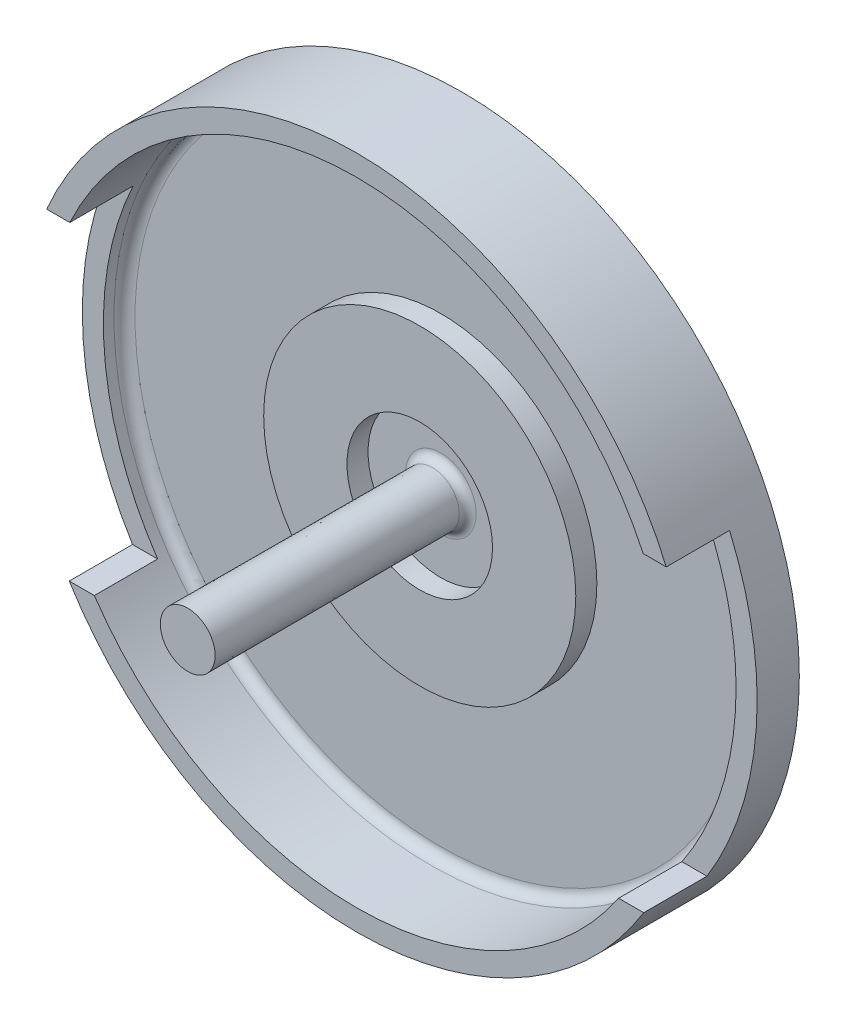
ISO-10303-21;
HEADER;
FILE_DESCRIPTION(('STEP AP214'),'2;1');
FILE_NAME('part.step','',(''),(''),'','','');
FILE_SCHEMA(('AUTOMOTIVE_DESIGN { 1 0 10303 214 1 1 1 1 }'));
ENDSEC;
DATA;
#1=APPLICATION_CONTEXT('core data for automotive mechanical design processes');
#2=APPLICATION_PROTOCOL_DEFINITION('international standard','automotive_design',2000,#1);
#3=PRODUCT_CONTEXT('',#1,'mechanical');
#4=PRODUCT('Part','Part','',(#3));
#5=PRODUCT_RELATED_PRODUCT_CATEGORY('part','',(#4));
#6=PRODUCT_DEFINITION_FORMATION('','',#4);
#7=PRODUCT_DEFINITION_CONTEXT('part definition',#1,'design');
#8=PRODUCT_DEFINITION('design','',#6,#7);
#9=PRODUCT_DEFINITION_SHAPE('','',#8);
#10=(LENGTH_UNIT() NAMED_UNIT(*) SI_UNIT(.MILLI.,.METRE.));
#11=(NAMED_UNIT(*) PLANE_ANGLE_UNIT() SI_UNIT($,.RADIAN.));
#12=(NAMED_UNIT(*) SI_UNIT($,.STERADIAN.) SOLID_ANGLE_UNIT());
#13=UNCERTAINTY_MEASURE_WITH_UNIT(LENGTH_MEASURE(1.E-05),#10,'distance_accuracy_value','');
#14=(GEOMETRIC_REPRESENTATION_CONTEXT(3) GLOBAL_UNCERTAINTY_ASSIGNED_CONTEXT((#13)) GLOBAL_UNIT_ASSIGNED_CONTEXT((#10,
#11,#12)) REPRESENTATION_CONTEXT('',''));
#15=CARTESIAN_POINT('',(0.,0.,0.));
#16=DIRECTION('',(0.,0.,1.));
#17=DIRECTION('',(1.,0.,0.));
#18=AXIS2_PLACEMENT_3D('',#15,#16,#17);
#19=CARTESIAN_POINT('',(0.,0.,1.));
#20=DIRECTION('',(0.,0.,1.));
#21=DIRECTION('',(1.,0.,0.));
#22=AXIS2_PLACEMENT_3D('',#19,#20,#21);
#23=PLANE('',#22);
#24=CARTESIAN_POINT('',(0.,0.,1.));
#25=DIRECTION('',(0.,0.,1.));
#26=DIRECTION('',(1.,0.,0.));
#27=AXIS2_PLACEMENT_3D('',#24,#25,#26);
#28=CIRCLE('',#27,1.67583420138795);
#29=CARTESIAN_POINT('',(1.67583420138795,0.,1.));
#30=VERTEX_POINT('',#29);
#31=EDGE_CURVE('E12',#30,#30,#28,.F.);
#32=ORIENTED_EDGE('',*,*,#31,.T.);
#33=EDGE_LOOP('',(#32));
#34=FACE_BOUND('',#33,.T.);
#35=CARTESIAN_POINT('',(0.,0.,1.));
#36=DIRECTION('',(0.,0.,1.));
#37=DIRECTION('',(1.,0.,0.));
#38=AXIS2_PLACEMENT_3D('',#35,#36,#37);
#39=CIRCLE('',#38,3.45);
#40=CARTESIAN_POINT('',(3.45,0.,1.));
#41=VERTEX_POINT('',#40);
#42=EDGE_CURVE('E392',#41,#41,#39,.T.);
#43=ORIENTED_EDGE('',*,*,#42,.T.);
#44=EDGE_LOOP('',(#43));
#45=FACE_BOUND('',#44,.T.);
#46=ADVANCED_FACE('F43',(#34,#45),#23,.T.);
#47=CARTESIAN_POINT('',(0.,0.,5.));
#48=DIRECTION('',(0.,0.,1.));
#49=DIRECTION('',(1.,0.,0.));
#50=AXIS2_PLACEMENT_3D('',#47,#48,#49);
#51=PLANE('',#50);
#52=CARTESIAN_POINT('',(0.,0.,5.));
#53=DIRECTION('',(0.,0.,1.));
#54=DIRECTION('',(1.,0.,0.));
#55=AXIS2_PLACEMENT_3D('',#52,#53,#54);
#56=CIRCLE('',#55,16.);
#57=CARTESIAN_POINT('',(-13.6201960323075,-8.39584778575195,5.));
#58=VERTEX_POINT('',#57);
#59=CARTESIAN_POINT('',(13.6201960323075,-8.39584778575195,5.));
#60=VERTEX_POINT('',#59);
#61=EDGE_CURVE('E156',#58,#60,#56,.T.);
#62=ORIENTED_EDGE('',*,*,#61,.T.);
#63=DIRECTION('',(-1.,0.,0.));
#64=VECTOR('',#63,1.);
#65=CARTESIAN_POINT('',(0.,-8.39584778575195,5.));
#66=LINE('',#65,#64);
#67=CARTESIAN_POINT('',(12.4301946870708,-8.39584778575195,5.));
#68=VERTEX_POINT('',#67);
#69=EDGE_CURVE('E112',#60,#68,#66,.T.);
#70=ORIENTED_EDGE('',*,*,#69,.T.);
#71=CARTESIAN_POINT('',(0.,0.,5.));
#72=DIRECTION('',(0.,0.,1.));
#73=DIRECTION('',(1.,0.,0.));
#74=AXIS2_PLACEMENT_3D('',#71,#72,#73);
#75=CIRCLE('',#74,15.);
#76=CARTESIAN_POINT('',(-12.4301946870708,-8.39584778575195,5.));
#77=VERTEX_POINT('',#76);
#78=EDGE_CURVE('E153',#77,#68,#75,.T.);
#79=ORIENTED_EDGE('',*,*,#78,.F.);
#80=DIRECTION('',(1.,0.,0.));
#81=VECTOR('',#80,1.);
#82=CARTESIAN_POINT('',(0.,-8.39584778575195,5.));
#83=LINE('',#82,#81);
#84=EDGE_CURVE('E145',#58,#77,#83,.T.);
#85=ORIENTED_EDGE('',*,*,#84,.F.);
#86=EDGE_LOOP('',(#62,#70,#79,#85));
#87=FACE_BOUND('',#86,.T.);
#88=ADVANCED_FACE('F197',(#87),#51,.T.);
#89=CARTESIAN_POINT('',(0.,0.,5.));
#90=DIRECTION('',(0.,0.,-1.));
#91=DIRECTION('',(-1.,0.,0.));
#92=AXIS2_PLACEMENT_3D('',#89,#90,#91);
#93=CYLINDRICAL_SURFACE('',#92,16.);
#94=CARTESIAN_POINT('',(0.,0.,0.));
#95=DIRECTION('',(0.,0.,1.));
#96=DIRECTION('',(1.,0.,0.));
#97=AXIS2_PLACEMENT_3D('',#94,#95,#96);
#98=CIRCLE('',#97,16.);
#99=CARTESIAN_POINT('',(16.,0.,0.));
#100=VERTEX_POINT('',#99);
#101=EDGE_CURVE('E159',#100,#100,#98,.T.);
#102=ORIENTED_EDGE('',*,*,#101,.T.);
#103=EDGE_LOOP('',(#102));
#104=FACE_BOUND('',#103,.T.);
#105=CARTESIAN_POINT('',(14.6905696553376,6.33933460243845,5.));
#106=VERTEX_POINT('',#105);
#107=CARTESIAN_POINT('',(-14.6905696553376,6.33933460243845,5.));
#108=VERTEX_POINT('',#107);
#109=EDGE_CURVE('E130',#106,#108,#56,.T.);
#110=ORIENTED_EDGE('',*,*,#109,.F.);
#111=DIRECTION('',(0.,0.,-1.));
#112=VECTOR('',#111,1.);
#113=CARTESIAN_POINT('',(14.6905696553376,6.33933460243845,5.));
#114=LINE('',#113,#112);
#115=CARTESIAN_POINT('',(14.6905696553376,6.33933460243845,2.));
#116=VERTEX_POINT('',#115);
#117=EDGE_CURVE('E117',#106,#116,#114,.T.);
#118=ORIENTED_EDGE('',*,*,#117,.T.);
#119=CARTESIAN_POINT('',(0.,0.,2.));
#120=DIRECTION('',(0.,0.,-1.));
#121=DIRECTION('',(-1.,0.,0.));
#122=AXIS2_PLACEMENT_3D('',#119,#120,#121);
#123=CIRCLE('',#122,16.);
#124=CARTESIAN_POINT('',(13.6201960323075,-8.39584778575195,2.));
#125=VERTEX_POINT('',#124);
#126=EDGE_CURVE('E110',#116,#125,#123,.T.);
#127=ORIENTED_EDGE('',*,*,#126,.T.);
#128=DIRECTION('',(0.,0.,-1.));
#129=VECTOR('',#128,1.);
#130=CARTESIAN_POINT('',(13.6201960323075,-8.39584778575195,5.));
#131=LINE('',#130,#129);
#132=EDGE_CURVE('E134',#60,#125,#131,.T.);
#133=ORIENTED_EDGE('',*,*,#132,.F.);
#134=ORIENTED_EDGE('',*,*,#61,.F.);
#135=DIRECTION('',(0.,0.,-1.));
#136=VECTOR('',#135,1.);
#137=CARTESIAN_POINT('',(-13.6201960323075,-8.39584778575195,5.));
#138=LINE('',#137,#136);
#139=CARTESIAN_POINT('',(-13.6201960323075,-8.39584778575195,2.));
#140=VERTEX_POINT('',#139);
#141=EDGE_CURVE('E144',#58,#140,#138,.T.);
#142=ORIENTED_EDGE('',*,*,#141,.T.);
#143=CARTESIAN_POINT('',(0.,0.,2.));
#144=DIRECTION('',(0.,0.,-1.));
#145=DIRECTION('',(-1.,0.,0.));
#146=AXIS2_PLACEMENT_3D('',#143,#144,#145);
#147=CIRCLE('',#146,16.);
#148=CARTESIAN_POINT('',(-14.6905696553376,6.33933460243845,2.));
#149=VERTEX_POINT('',#148);
#150=EDGE_CURVE('E138',#140,#149,#147,.T.);
#151=ORIENTED_EDGE('',*,*,#150,.T.);
#152=DIRECTION('',(0.,0.,-1.));
#153=VECTOR('',#152,1.);
#154=CARTESIAN_POINT('',(-14.6905696553376,6.33933460243845,5.));
#155=LINE('',#154,#153);
#156=EDGE_CURVE('E147',#108,#149,#155,.T.);
#157=ORIENTED_EDGE('',*,*,#156,.F.);
#158=EDGE_LOOP('',(#110,#118,#127,#133,#134,#142,#151,#157));
#159=FACE_BOUND('',#158,.T.);
#160=ADVANCED_FACE('F129',(#104,#159),#93,.T.);
#161=DIRECTION('',(-1.,0.,0.));
#162=VECTOR('',#161,1.);
#163=CARTESIAN_POINT('',(0.,6.33933460243845,5.));
#164=LINE('',#163,#162);
#165=CARTESIAN_POINT('',(13.5945885115485,6.33933460243845,5.));
#166=VERTEX_POINT('',#165);
#167=EDGE_CURVE('E127',#106,#166,#164,.T.);
#168=ORIENTED_EDGE('',*,*,#167,.F.);
#169=ORIENTED_EDGE('',*,*,#109,.T.);
#170=DIRECTION('',(1.,0.,0.));
#171=VECTOR('',#170,1.);
#172=CARTESIAN_POINT('',(0.,6.33933460243845,5.));
#173=LINE('',#172,#171);
#174=CARTESIAN_POINT('',(-13.5945885115485,6.33933460243845,5.));
#175=VERTEX_POINT('',#174);
#176=EDGE_CURVE('E146',#108,#175,#173,.T.);
#177=ORIENTED_EDGE('',*,*,#176,.T.);
#178=EDGE_CURVE('E155',#166,#175,#75,.T.);
#179=ORIENTED_EDGE('',*,*,#178,.F.);
#180=EDGE_LOOP('',(#168,#169,#177,#179));
#181=FACE_BOUND('',#180,.T.);
#182=ADVANCED_FACE('F202',(#181),#51,.T.);
#183=CARTESIAN_POINT('',(0.,0.,1.));
#184=DIRECTION('',(0.,0.,1.));
#185=DIRECTION('',(1.,0.,0.));
#186=AXIS2_PLACEMENT_3D('',#183,#184,#185);
#187=CYLINDRICAL_SURFACE('',#186,15.);
#188=CARTESIAN_POINT('',(0.,0.,2.));
#189=DIRECTION('',(0.,0.,-1.));
#190=DIRECTION('',(-1.,0.,0.));
#191=AXIS2_PLACEMENT_3D('',#188,#189,#190);
#192=CIRCLE('',#191,15.);
#193=CARTESIAN_POINT('',(12.4301946870708,-8.39584778575195,2.));
#194=VERTEX_POINT('',#193);
#195=CARTESIAN_POINT('',(13.5945885115485,6.33933460243845,2.));
#196=VERTEX_POINT('',#195);
#197=EDGE_CURVE('E180',#194,#196,#192,.F.);
#198=ORIENTED_EDGE('',*,*,#197,.T.);
#199=DIRECTION('',(0.,0.,1.));
#200=VECTOR('',#199,1.);
#201=CARTESIAN_POINT('',(13.5945885115485,6.33933460243845,1.));
#202=LINE('',#201,#200);
#203=EDGE_CURVE('E122',#196,#166,#202,.T.);
#204=ORIENTED_EDGE('',*,*,#203,.T.);
#205=ORIENTED_EDGE('',*,*,#178,.T.);
#206=DIRECTION('',(0.,0.,1.));
#207=VECTOR('',#206,1.);
#208=CARTESIAN_POINT('',(-13.5945885115485,6.33933460243845,1.));
#209=LINE('',#208,#207);
#210=CARTESIAN_POINT('',(-13.5945885115485,6.33933460243845,2.));
#211=VERTEX_POINT('',#210);
#212=EDGE_CURVE('E172',#211,#175,#209,.T.);
#213=ORIENTED_EDGE('',*,*,#212,.F.);
#214=CARTESIAN_POINT('',(0.,0.,2.));
#215=DIRECTION('',(0.,0.,-1.));
#216=DIRECTION('',(-1.,0.,0.));
#217=AXIS2_PLACEMENT_3D('',#214,#215,#216);
#218=CIRCLE('',#217,15.);
#219=CARTESIAN_POINT('',(-12.4301946870708,-8.39584778575195,2.));
#220=VERTEX_POINT('',#219);
#221=EDGE_CURVE('E166',#211,#220,#218,.F.);
#222=ORIENTED_EDGE('',*,*,#221,.T.);
#223=DIRECTION('',(0.,0.,1.));
#224=VECTOR('',#223,1.);
#225=CARTESIAN_POINT('',(-12.4301946870708,-8.39584778575195,1.));
#226=LINE('',#225,#224);
#227=EDGE_CURVE('E171',#220,#77,#226,.T.);
#228=ORIENTED_EDGE('',*,*,#227,.T.);
#229=ORIENTED_EDGE('',*,*,#78,.T.);
#230=DIRECTION('',(0.,0.,1.));
#231=VECTOR('',#230,1.);
#232=CARTESIAN_POINT('',(12.4301946870708,-8.39584778575195,1.));
#233=LINE('',#232,#231);
#234=EDGE_CURVE('E177',#194,#68,#233,.T.);
#235=ORIENTED_EDGE('',*,*,#234,.F.);
#236=EDGE_LOOP('',(#198,#204,#205,#213,#222,#228,#229,#235));
#237=FACE_BOUND('',#236,.T.);
#238=CARTESIAN_POINT('',(0.,0.,1.5));
#239=DIRECTION('',(0.,0.,1.));
#240=DIRECTION('',(1.,0.,0.));
#241=AXIS2_PLACEMENT_3D('',#238,#239,#240);
#242=CIRCLE('',#241,15.);
#243=CARTESIAN_POINT('',(15.,0.,1.5));
#244=VERTEX_POINT('',#243);
#245=EDGE_CURVE('E164',#244,#244,#242,.F.);
#246=ORIENTED_EDGE('',*,*,#245,.T.);
#247=EDGE_LOOP('',(#246));
#248=FACE_BOUND('',#247,.T.);
#249=ADVANCED_FACE('F250',(#237,#248),#187,.F.);
#250=CARTESIAN_POINT('',(0.,0.,0.));
#251=DIRECTION('',(0.,0.,1.));
#252=DIRECTION('',(1.,0.,0.));
#253=AXIS2_PLACEMENT_3D('',#250,#251,#252);
#254=PLANE('',#253);
#255=ORIENTED_EDGE('',*,*,#101,.F.);
#256=EDGE_LOOP('',(#255));
#257=FACE_BOUND('',#256,.T.);
#258=ADVANCED_FACE('F244',(#257),#254,.F.);
#259=CARTESIAN_POINT('',(0.,0.,1.));
#260=DIRECTION('',(0.,0.,1.));
#261=DIRECTION('',(1.,0.,0.));
#262=AXIS2_PLACEMENT_3D('',#259,#260,#261);
#263=PLANE('',#262);
#264=CARTESIAN_POINT('',(0.,0.,1.));
#265=DIRECTION('',(0.,0.,1.));
#266=DIRECTION('',(1.,0.,0.));
#267=AXIS2_PLACEMENT_3D('',#264,#265,#266);
#268=CIRCLE('',#267,7.4);
#269=CARTESIAN_POINT('',(7.4,0.,1.));
#270=VERTEX_POINT('',#269);
#271=EDGE_CURVE('E394',#270,#270,#268,.T.);
#272=ORIENTED_EDGE('',*,*,#271,.F.);
#273=EDGE_LOOP('',(#272));
#274=FACE_BOUND('',#273,.T.);
#275=CARTESIAN_POINT('',(0.,0.,1.));
#276=DIRECTION('',(0.,0.,1.));
#277=DIRECTION('',(1.,0.,0.));
#278=AXIS2_PLACEMENT_3D('',#275,#276,#277);
#279=CIRCLE('',#278,14.5);
#280=CARTESIAN_POINT('',(14.5,0.,1.));
#281=VERTEX_POINT('',#280);
#282=EDGE_CURVE('E157',#281,#281,#279,.T.);
#283=ORIENTED_EDGE('',*,*,#282,.T.);
#284=EDGE_LOOP('',(#283));
#285=FACE_BOUND('',#284,.T.);
#286=ADVANCED_FACE('F245',(#274,#285),#263,.T.);
#287=CARTESIAN_POINT('',(0.,0.,1.5));
#288=DIRECTION('',(0.,0.,1.));
#289=DIRECTION('',(1.,0.,0.));
#290=AXIS2_PLACEMENT_3D('',#287,#288,#289);
#291=TOROIDAL_SURFACE('',#290,14.5,0.5);
#292=ORIENTED_EDGE('',*,*,#245,.F.);
#293=EDGE_LOOP('',(#292));
#294=FACE_BOUND('',#293,.T.);
#295=ORIENTED_EDGE('',*,*,#282,.F.);
#296=EDGE_LOOP('',(#295));
#297=FACE_BOUND('',#296,.T.);
#298=ADVANCED_FACE('F239',(#294,#297),#291,.F.);
#299=CARTESIAN_POINT('',(-17.0905034214387,6.33933460243845,2.));
#300=DIRECTION('',(0.,-1.,0.));
#301=DIRECTION('',(0.,0.,-1.));
#302=AXIS2_PLACEMENT_3D('',#299,#300,#301);
#303=PLANE('',#302);
#304=ORIENTED_EDGE('',*,*,#156,.T.);
#305=DIRECTION('',(1.,0.,0.));
#306=VECTOR('',#305,1.);
#307=CARTESIAN_POINT('',(-17.0905034214387,6.33933460243845,2.));
#308=LINE('',#307,#306);
#309=EDGE_CURVE('E128',#149,#211,#308,.T.);
#310=ORIENTED_EDGE('',*,*,#309,.T.);
#311=ORIENTED_EDGE('',*,*,#212,.T.);
#312=ORIENTED_EDGE('',*,*,#176,.F.);
#313=EDGE_LOOP('',(#304,#310,#311,#312));
#314=FACE_BOUND('',#313,.T.);
#315=ADVANCED_FACE('F236',(#314),#303,.T.);
#316=CARTESIAN_POINT('',(-17.0905034214387,-8.39584778575195,2.));
#317=DIRECTION('',(0.,-1.,0.));
#318=DIRECTION('',(0.,0.,-1.));
#319=AXIS2_PLACEMENT_3D('',#316,#317,#318);
#320=PLANE('',#319);
#321=ORIENTED_EDGE('',*,*,#84,.T.);
#322=ORIENTED_EDGE('',*,*,#227,.F.);
#323=DIRECTION('',(1.,0.,0.));
#324=VECTOR('',#323,1.);
#325=CARTESIAN_POINT('',(-17.0905034214387,-8.39584778575195,2.));
#326=LINE('',#325,#324);
#327=EDGE_CURVE('E67',#140,#220,#326,.T.);
#328=ORIENTED_EDGE('',*,*,#327,.F.);
#329=ORIENTED_EDGE('',*,*,#141,.F.);
#330=EDGE_LOOP('',(#321,#322,#328,#329));
#331=FACE_BOUND('',#330,.T.);
#332=ADVANCED_FACE('F231',(#331),#320,.F.);
#333=CARTESIAN_POINT('',(0.,0.,2.));
#334=DIRECTION('',(0.,0.,-1.));
#335=DIRECTION('',(-1.,0.,0.));
#336=AXIS2_PLACEMENT_3D('',#333,#334,#335);
#337=PLANE('',#336);
#338=ORIENTED_EDGE('',*,*,#327,.T.);
#339=ORIENTED_EDGE('',*,*,#221,.F.);
#340=ORIENTED_EDGE('',*,*,#309,.F.);
#341=ORIENTED_EDGE('',*,*,#150,.F.);
#342=EDGE_LOOP('',(#338,#339,#340,#341));
#343=FACE_BOUND('',#342,.T.);
#344=ADVANCED_FACE('F229',(#343),#337,.F.);
#345=CARTESIAN_POINT('',(17.0905034214387,6.33933460243845,2.));
#346=DIRECTION('',(0.,1.,0.));
#347=DIRECTION('',(0.,0.,1.));
#348=AXIS2_PLACEMENT_3D('',#345,#346,#347);
#349=PLANE('',#348);
#350=ORIENTED_EDGE('',*,*,#167,.T.);
#351=ORIENTED_EDGE('',*,*,#203,.F.);
#352=DIRECTION('',(-1.,0.,0.));
#353=VECTOR('',#352,1.);
#354=CARTESIAN_POINT('',(17.0905034214387,6.33933460243845,2.));
#355=LINE('',#354,#353);
#356=EDGE_CURVE('E59',#116,#196,#355,.T.);
#357=ORIENTED_EDGE('',*,*,#356,.F.);
#358=ORIENTED_EDGE('',*,*,#117,.F.);
#359=EDGE_LOOP('',(#350,#351,#357,#358));
#360=FACE_BOUND('',#359,.T.);
#361=ADVANCED_FACE('F120',(#360),#349,.F.);
#362=CARTESIAN_POINT('',(17.0905034214387,-8.39584778575195,2.));
#363=DIRECTION('',(0.,1.,0.));
#364=DIRECTION('',(0.,0.,1.));
#365=AXIS2_PLACEMENT_3D('',#362,#363,#364);
#366=PLANE('',#365);
#367=ORIENTED_EDGE('',*,*,#132,.T.);
#368=DIRECTION('',(-1.,0.,0.));
#369=VECTOR('',#368,1.);
#370=CARTESIAN_POINT('',(17.0905034214387,-8.39584778575195,2.));
#371=LINE('',#370,#369);
#372=EDGE_CURVE('E109',#125,#194,#371,.T.);
#373=ORIENTED_EDGE('',*,*,#372,.T.);
#374=ORIENTED_EDGE('',*,*,#234,.T.);
#375=ORIENTED_EDGE('',*,*,#69,.F.);
#376=EDGE_LOOP('',(#367,#373,#374,#375));
#377=FACE_BOUND('',#376,.T.);
#378=ADVANCED_FACE('F223',(#377),#366,.T.);
#379=CARTESIAN_POINT('',(0.,0.,2.));
#380=DIRECTION('',(0.,0.,-1.));
#381=DIRECTION('',(1.,0.,0.));
#382=AXIS2_PLACEMENT_3D('',#379,#380,#381);
#383=PLANE('',#382);
#384=ORIENTED_EDGE('',*,*,#356,.T.);
#385=ORIENTED_EDGE('',*,*,#197,.F.);
#386=ORIENTED_EDGE('',*,*,#372,.F.);
#387=ORIENTED_EDGE('',*,*,#126,.F.);
#388=EDGE_LOOP('',(#384,#385,#386,#387));
#389=FACE_BOUND('',#388,.T.);
#390=ADVANCED_FACE('F108',(#389),#383,.F.);
#391=CARTESIAN_POINT('',(0.,0.,2.));
#392=DIRECTION('',(0.,0.,-1.));
#393=DIRECTION('',(-1.,0.,0.));
#394=AXIS2_PLACEMENT_3D('',#391,#392,#393);
#395=CYLINDRICAL_SURFACE('',#394,7.4);
#396=CARTESIAN_POINT('',(0.,0.,2.));
#397=DIRECTION('',(0.,0.,1.));
#398=DIRECTION('',(1.,0.,0.));
#399=AXIS2_PLACEMENT_3D('',#396,#397,#398);
#400=CIRCLE('',#399,7.4);
#401=CARTESIAN_POINT('',(7.4,0.,2.));
#402=VERTEX_POINT('',#401);
#403=EDGE_CURVE('E124',#402,#402,#400,.T.);
#404=ORIENTED_EDGE('',*,*,#403,.F.);
#405=EDGE_LOOP('',(#404));
#406=FACE_BOUND('',#405,.T.);
#407=ORIENTED_EDGE('',*,*,#271,.T.);
#408=EDGE_LOOP('',(#407));
#409=FACE_BOUND('',#408,.T.);
#410=ADVANCED_FACE('F220',(#406,#409),#395,.T.);
#411=CARTESIAN_POINT('',(0.,0.,2.));
#412=DIRECTION('',(0.,0.,1.));
#413=DIRECTION('',(1.,0.,0.));
#414=AXIS2_PLACEMENT_3D('',#411,#412,#413);
#415=PLANE('',#414);
#416=CARTESIAN_POINT('',(0.,0.,2.));
#417=DIRECTION('',(0.,0.,1.));
#418=DIRECTION('',(1.,0.,0.));
#419=AXIS2_PLACEMENT_3D('',#416,#417,#418);
#420=CIRCLE('',#419,3.45);
#421=CARTESIAN_POINT('',(3.45,0.,2.));
#422=VERTEX_POINT('',#421);
#423=EDGE_CURVE('E374',#422,#422,#420,.T.);
#424=ORIENTED_EDGE('',*,*,#423,.F.);
#425=EDGE_LOOP('',(#424));
#426=FACE_BOUND('',#425,.T.);
#427=ORIENTED_EDGE('',*,*,#403,.T.);
#428=EDGE_LOOP('',(#427));
#429=FACE_BOUND('',#428,.T.);
#430=ADVANCED_FACE('F215',(#426,#429),#415,.T.);
#431=CARTESIAN_POINT('',(0.,0.,1.));
#432=DIRECTION('',(0.,0.,1.));
#433=DIRECTION('',(1.,0.,0.));
#434=AXIS2_PLACEMENT_3D('',#431,#432,#433);
#435=CYLINDRICAL_SURFACE('',#434,3.45);
#436=ORIENTED_EDGE('',*,*,#42,.F.);
#437=EDGE_LOOP('',(#436));
#438=FACE_BOUND('',#437,.T.);
#439=ORIENTED_EDGE('',*,*,#423,.T.);
#440=EDGE_LOOP('',(#439));
#441=FACE_BOUND('',#440,.T.);
#442=ADVANCED_FACE('F208',(#438,#441),#435,.F.);
#443=CARTESIAN_POINT('',(0.,0.,13.));
#444=DIRECTION('',(0.,0.,1.));
#445=DIRECTION('',(1.,0.,0.));
#446=AXIS2_PLACEMENT_3D('',#443,#444,#445);
#447=PLANE('',#446);
#448=CARTESIAN_POINT('',(0.,0.,13.));
#449=DIRECTION('',(0.,0.,1.));
#450=DIRECTION('',(1.,0.,0.));
#451=AXIS2_PLACEMENT_3D('',#448,#449,#450);
#452=CIRCLE('',#451,1.3);
#453=CARTESIAN_POINT('',(1.3,0.,13.));
#454=VERTEX_POINT('',#453);
#455=EDGE_CURVE('E375',#454,#454,#452,.T.);
#456=ORIENTED_EDGE('',*,*,#455,.T.);
#457=EDGE_LOOP('',(#456));
#458=FACE_BOUND('',#457,.T.);
#459=ADVANCED_FACE('F191',(#458),#447,.T.);
#460=CARTESIAN_POINT('',(0.,0.,1.));
#461=DIRECTION('',(0.,0.,1.));
#462=DIRECTION('',(1.,0.,0.));
#463=AXIS2_PLACEMENT_3D('',#460,#461,#462);
#464=CONICAL_SURFACE('',#463,1.275,0.0020833303192594);
#465=CARTESIAN_POINT('',(0.,0.,1.40083333152489));
#466=DIRECTION('',(0.,0.,1.));
#467=DIRECTION('',(1.,0.,0.));
#468=AXIS2_PLACEMENT_3D('',#465,#466,#467);
#469=CIRCLE('',#468,1.27583506944068);
#470=CARTESIAN_POINT('',(1.27583506944068,0.,1.40083333152489));
#471=VERTEX_POINT('',#470);
#472=EDGE_CURVE('E51',#471,#471,#469,.T.);
#473=ORIENTED_EDGE('',*,*,#472,.T.);
#474=EDGE_LOOP('',(#473));
#475=FACE_BOUND('',#474,.T.);
#476=ORIENTED_EDGE('',*,*,#455,.F.);
#477=EDGE_LOOP('',(#476));
#478=FACE_BOUND('',#477,.T.);
#479=ADVANCED_FACE('F183',(#475,#478),#464,.T.);
#480=CARTESIAN_POINT('',(0.,0.,1.4));
#481=DIRECTION('',(0.,0.,1.));
#482=DIRECTION('',(1.,0.,0.));
#483=AXIS2_PLACEMENT_3D('',#480,#481,#482);
#484=TOROIDAL_SURFACE('',#483,1.67583420138795,0.4);
#485=ORIENTED_EDGE('',*,*,#31,.F.);
#486=EDGE_LOOP('',(#485));
#487=FACE_BOUND('',#486,.T.);
#488=ORIENTED_EDGE('',*,*,#472,.F.);
#489=EDGE_LOOP('',(#488));
#490=FACE_BOUND('',#489,.T.);
#491=ADVANCED_FACE('F44',(#487,#490),#484,.F.);
#492=CLOSED_SHELL('',(#46,#88,#160,#182,#249,#258,#286,#298,#315,#332,#344,#361,#378,#390,#410,
#430,#442,#459,#479,#491));
#493=MANIFOLD_SOLID_BREP('B2',#492);
#494=ADVANCED_BREP_SHAPE_REPRESENTATION('',(#18,#493),#14);
#495=SHAPE_DEFINITION_REPRESENTATION(#9,#494);
ENDSEC;
END-ISO-10303-21;
